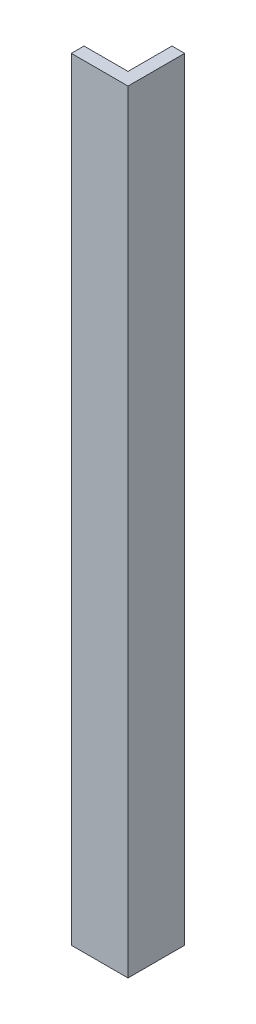
ISO-10303-21;
HEADER;
FILE_DESCRIPTION(('STEP AP214'),'2;1');
FILE_NAME('part.step','',(''),(''),'','','');
FILE_SCHEMA(('AUTOMOTIVE_DESIGN { 1 0 10303 214 1 1 1 1 }'));
ENDSEC;
DATA;
#1=APPLICATION_CONTEXT('core data for automotive mechanical design processes');
#2=APPLICATION_PROTOCOL_DEFINITION('international standard','automotive_design',2000,#1);
#3=PRODUCT_CONTEXT('',#1,'mechanical');
#4=PRODUCT('Part','Part','',(#3));
#5=PRODUCT_RELATED_PRODUCT_CATEGORY('part','',(#4));
#6=PRODUCT_DEFINITION_FORMATION('','',#4);
#7=PRODUCT_DEFINITION_CONTEXT('part definition',#1,'design');
#8=PRODUCT_DEFINITION('design','',#6,#7);
#9=PRODUCT_DEFINITION_SHAPE('','',#8);
#10=(LENGTH_UNIT() NAMED_UNIT(*) SI_UNIT(.MILLI.,.METRE.));
#11=(NAMED_UNIT(*) PLANE_ANGLE_UNIT() SI_UNIT($,.RADIAN.));
#12=(NAMED_UNIT(*) SI_UNIT($,.STERADIAN.) SOLID_ANGLE_UNIT());
#13=UNCERTAINTY_MEASURE_WITH_UNIT(LENGTH_MEASURE(1.E-05),#10,'distance_accuracy_value','');
#14=(GEOMETRIC_REPRESENTATION_CONTEXT(3) GLOBAL_UNCERTAINTY_ASSIGNED_CONTEXT((#13)) GLOBAL_UNIT_ASSIGNED_CONTEXT((#10,
#11,#12)) REPRESENTATION_CONTEXT('',''));
#15=CARTESIAN_POINT('',(0.,0.,0.));
#16=DIRECTION('',(0.,0.,1.));
#17=DIRECTION('',(1.,0.,0.));
#18=AXIS2_PLACEMENT_3D('',#15,#16,#17);
#19=CARTESIAN_POINT('',(-3.17500000000001,213.221477246639,-3.17500000000001));
#20=DIRECTION('',(-1.,0.,0.));
#21=DIRECTION('',(0.,0.,1.));
#22=AXIS2_PLACEMENT_3D('',#19,#20,#21);
#23=PLANE('',#22);
#24=DIRECTION('',(0.,-1.,0.));
#25=VECTOR('',#24,1.);
#26=CARTESIAN_POINT('',(-3.17500000000001,213.221477246639,-3.17500000000001));
#27=LINE('',#26,#25);
#28=CARTESIAN_POINT('',(-3.17500000000001,193.175,-3.17500000000001));
#29=VERTEX_POINT('',#28);
#30=CARTESIAN_POINT('',(-3.17500000000001,0.,-3.17500000000001));
#31=VERTEX_POINT('',#30);
#32=EDGE_CURVE('E125',#29,#31,#27,.T.);
#33=ORIENTED_EDGE('',*,*,#32,.F.);
#34=DIRECTION('',(0.,0.,-1.));
#35=VECTOR('',#34,1.);
#36=CARTESIAN_POINT('',(-3.17500000000001,193.175,-3.175));
#37=LINE('',#36,#35);
#38=CARTESIAN_POINT('',(-3.175,193.175,-14.175));
#39=VERTEX_POINT('',#38);
#40=EDGE_CURVE('E123',#29,#39,#37,.T.);
#41=ORIENTED_EDGE('',*,*,#40,.T.);
#42=DIRECTION('',(0.,-1.,0.));
#43=VECTOR('',#42,1.);
#44=CARTESIAN_POINT('',(-3.175,213.221477246639,-14.175));
#45=LINE('',#44,#43);
#46=CARTESIAN_POINT('',(-3.175,0.,-14.175));
#47=VERTEX_POINT('',#46);
#48=EDGE_CURVE('E37',#39,#47,#45,.T.);
#49=ORIENTED_EDGE('',*,*,#48,.T.);
#50=DIRECTION('',(0.,0.,-1.));
#51=VECTOR('',#50,1.);
#52=CARTESIAN_POINT('',(-3.17500000000001,0.,-3.17500000000001));
#53=LINE('',#52,#51);
#54=EDGE_CURVE('E116',#31,#47,#53,.T.);
#55=ORIENTED_EDGE('',*,*,#54,.F.);
#56=EDGE_LOOP('',(#33,#41,#49,#55));
#57=FACE_BOUND('',#56,.T.);
#58=ADVANCED_FACE('F33',(#57),#23,.T.);
#59=CARTESIAN_POINT('',(-3.17500000000001,213.221477246639,-3.17500000000001));
#60=DIRECTION('',(0.,0.,1.));
#61=DIRECTION('',(1.,0.,0.));
#62=AXIS2_PLACEMENT_3D('',#59,#60,#61);
#63=PLANE('',#62);
#64=DIRECTION('',(-1.,0.,0.));
#65=VECTOR('',#64,1.);
#66=CARTESIAN_POINT('',(-3.17500000000002,193.175,-3.17500000000001));
#67=LINE('',#66,#65);
#68=CARTESIAN_POINT('',(-14.175,193.175,-3.175));
#69=VERTEX_POINT('',#68);
#70=EDGE_CURVE('E72',#29,#69,#67,.T.);
#71=ORIENTED_EDGE('',*,*,#70,.F.);
#72=ORIENTED_EDGE('',*,*,#32,.T.);
#73=DIRECTION('',(-1.,0.,0.));
#74=VECTOR('',#73,1.);
#75=CARTESIAN_POINT('',(-3.17500000000001,0.,-3.17500000000001));
#76=LINE('',#75,#74);
#77=CARTESIAN_POINT('',(-14.175,0.,-3.175));
#78=VERTEX_POINT('',#77);
#79=EDGE_CURVE('E127',#31,#78,#76,.T.);
#80=ORIENTED_EDGE('',*,*,#79,.T.);
#81=DIRECTION('',(0.,-1.,0.));
#82=VECTOR('',#81,1.);
#83=CARTESIAN_POINT('',(-14.175,213.221477246639,-3.175));
#84=LINE('',#83,#82);
#85=EDGE_CURVE('E128',#69,#78,#84,.T.);
#86=ORIENTED_EDGE('',*,*,#85,.F.);
#87=EDGE_LOOP('',(#71,#72,#80,#86));
#88=FACE_BOUND('',#87,.T.);
#89=ADVANCED_FACE('F142',(#88),#63,.F.);
#90=CARTESIAN_POINT('',(-14.175,213.221477246639,-3.175));
#91=DIRECTION('',(1.,0.,0.));
#92=DIRECTION('',(0.,0.,-1.));
#93=AXIS2_PLACEMENT_3D('',#90,#91,#92);
#94=PLANE('',#93);
#95=DIRECTION('',(0.,0.,1.));
#96=VECTOR('',#95,1.);
#97=CARTESIAN_POINT('',(-14.175,193.175,-3.175));
#98=LINE('',#97,#96);
#99=CARTESIAN_POINT('',(-14.175,193.175,0.));
#100=VERTEX_POINT('',#99);
#101=EDGE_CURVE('E42',#69,#100,#98,.T.);
#102=ORIENTED_EDGE('',*,*,#101,.F.);
#103=ORIENTED_EDGE('',*,*,#85,.T.);
#104=DIRECTION('',(0.,0.,1.));
#105=VECTOR('',#104,1.);
#106=CARTESIAN_POINT('',(-14.175,0.,-3.175));
#107=LINE('',#106,#105);
#108=CARTESIAN_POINT('',(-14.175,0.,0.));
#109=VERTEX_POINT('',#108);
#110=EDGE_CURVE('E119',#78,#109,#107,.T.);
#111=ORIENTED_EDGE('',*,*,#110,.T.);
#112=DIRECTION('',(0.,-1.,0.));
#113=VECTOR('',#112,1.);
#114=CARTESIAN_POINT('',(-14.175,213.221477246639,0.));
#115=LINE('',#114,#113);
#116=EDGE_CURVE('E93',#100,#109,#115,.T.);
#117=ORIENTED_EDGE('',*,*,#116,.F.);
#118=EDGE_LOOP('',(#102,#103,#111,#117));
#119=FACE_BOUND('',#118,.T.);
#120=ADVANCED_FACE('F141',(#119),#94,.F.);
#121=CARTESIAN_POINT('',(0.,213.221477246639,0.));
#122=DIRECTION('',(0.,0.,1.));
#123=DIRECTION('',(1.,0.,0.));
#124=AXIS2_PLACEMENT_3D('',#121,#122,#123);
#125=PLANE('',#124);
#126=DIRECTION('',(0.,-1.,0.));
#127=VECTOR('',#126,1.);
#128=CARTESIAN_POINT('',(0.,213.221477246639,0.));
#129=LINE('',#128,#127);
#130=CARTESIAN_POINT('',(0.,193.175,0.));
#131=VERTEX_POINT('',#130);
#132=CARTESIAN_POINT('',(0.,0.,0.));
#133=VERTEX_POINT('',#132);
#134=EDGE_CURVE('E104',#131,#133,#129,.T.);
#135=ORIENTED_EDGE('',*,*,#134,.F.);
#136=DIRECTION('',(-1.,0.,0.));
#137=VECTOR('',#136,1.);
#138=CARTESIAN_POINT('',(0.,193.175,0.));
#139=LINE('',#138,#137);
#140=EDGE_CURVE('E110',#131,#100,#139,.T.);
#141=ORIENTED_EDGE('',*,*,#140,.T.);
#142=ORIENTED_EDGE('',*,*,#116,.T.);
#143=DIRECTION('',(-1.,0.,0.));
#144=VECTOR('',#143,1.);
#145=CARTESIAN_POINT('',(0.,0.,0.));
#146=LINE('',#145,#144);
#147=EDGE_CURVE('E122',#133,#109,#146,.T.);
#148=ORIENTED_EDGE('',*,*,#147,.F.);
#149=EDGE_LOOP('',(#135,#141,#142,#148));
#150=FACE_BOUND('',#149,.T.);
#151=ADVANCED_FACE('F149',(#150),#125,.T.);
#152=CARTESIAN_POINT('',(0.,213.221477246639,-14.175));
#153=DIRECTION('',(1.,0.,0.));
#154=DIRECTION('',(0.,0.,-1.));
#155=AXIS2_PLACEMENT_3D('',#152,#153,#154);
#156=PLANE('',#155);
#157=DIRECTION('',(0.,-1.,0.));
#158=VECTOR('',#157,1.);
#159=CARTESIAN_POINT('',(0.,213.221477246639,-14.175));
#160=LINE('',#159,#158);
#161=CARTESIAN_POINT('',(0.,193.175,-14.175));
#162=VERTEX_POINT('',#161);
#163=CARTESIAN_POINT('',(0.,0.,-14.175));
#164=VERTEX_POINT('',#163);
#165=EDGE_CURVE('E55',#162,#164,#160,.T.);
#166=ORIENTED_EDGE('',*,*,#165,.F.);
#167=DIRECTION('',(0.,0.,1.));
#168=VECTOR('',#167,1.);
#169=CARTESIAN_POINT('',(0.,193.175,-14.175));
#170=LINE('',#169,#168);
#171=EDGE_CURVE('E99',#162,#131,#170,.T.);
#172=ORIENTED_EDGE('',*,*,#171,.T.);
#173=ORIENTED_EDGE('',*,*,#134,.T.);
#174=DIRECTION('',(0.,0.,1.));
#175=VECTOR('',#174,1.);
#176=CARTESIAN_POINT('',(0.,0.,-14.175));
#177=LINE('',#176,#175);
#178=EDGE_CURVE('E102',#164,#133,#177,.T.);
#179=ORIENTED_EDGE('',*,*,#178,.F.);
#180=EDGE_LOOP('',(#166,#172,#173,#179));
#181=FACE_BOUND('',#180,.T.);
#182=ADVANCED_FACE('F97',(#181),#156,.T.);
#183=CARTESIAN_POINT('',(0.,213.221477246639,-14.175));
#184=DIRECTION('',(0.,0.,1.));
#185=DIRECTION('',(1.,0.,0.));
#186=AXIS2_PLACEMENT_3D('',#183,#184,#185);
#187=PLANE('',#186);
#188=DIRECTION('',(-1.,0.,0.));
#189=VECTOR('',#188,1.);
#190=CARTESIAN_POINT('',(0.,193.175,-14.175));
#191=LINE('',#190,#189);
#192=EDGE_CURVE('E11',#162,#39,#191,.T.);
#193=ORIENTED_EDGE('',*,*,#192,.F.);
#194=ORIENTED_EDGE('',*,*,#165,.T.);
#195=DIRECTION('',(-1.,0.,0.));
#196=VECTOR('',#195,1.);
#197=CARTESIAN_POINT('',(0.,0.,-14.175));
#198=LINE('',#197,#196);
#199=EDGE_CURVE('E103',#164,#47,#198,.T.);
#200=ORIENTED_EDGE('',*,*,#199,.T.);
#201=ORIENTED_EDGE('',*,*,#48,.F.);
#202=EDGE_LOOP('',(#193,#194,#200,#201));
#203=FACE_BOUND('',#202,.T.);
#204=ADVANCED_FACE('F105',(#203),#187,.F.);
#205=CARTESIAN_POINT('',(0.,0.,0.));
#206=DIRECTION('',(0.,1.,0.));
#207=DIRECTION('',(0.,0.,1.));
#208=AXIS2_PLACEMENT_3D('',#205,#206,#207);
#209=PLANE('',#208);
#210=ORIENTED_EDGE('',*,*,#54,.T.);
#211=ORIENTED_EDGE('',*,*,#199,.F.);
#212=ORIENTED_EDGE('',*,*,#178,.T.);
#213=ORIENTED_EDGE('',*,*,#147,.T.);
#214=ORIENTED_EDGE('',*,*,#110,.F.);
#215=ORIENTED_EDGE('',*,*,#79,.F.);
#216=EDGE_LOOP('',(#210,#211,#212,#213,#214,#215));
#217=FACE_BOUND('',#216,.T.);
#218=ADVANCED_FACE('F140',(#217),#209,.F.);
#219=CARTESIAN_POINT('',(-0.175000000000005,193.175,4.87147724663878));
#220=DIRECTION('',(0.,1.,0.));
#221=DIRECTION('',(-1.,0.,0.));
#222=AXIS2_PLACEMENT_3D('',#219,#220,#221);
#223=PLANE('',#222);
#224=ORIENTED_EDGE('',*,*,#40,.F.);
#225=ORIENTED_EDGE('',*,*,#70,.T.);
#226=ORIENTED_EDGE('',*,*,#101,.T.);
#227=ORIENTED_EDGE('',*,*,#140,.F.);
#228=ORIENTED_EDGE('',*,*,#171,.F.);
#229=ORIENTED_EDGE('',*,*,#192,.T.);
#230=EDGE_LOOP('',(#224,#225,#226,#227,#228,#229));
#231=FACE_BOUND('',#230,.T.);
#232=ADVANCED_FACE('F35',(#231),#223,.T.);
#233=CLOSED_SHELL('',(#58,#89,#120,#151,#182,#204,#218,#232));
#234=MANIFOLD_SOLID_BREP('B2',#233);
#235=ADVANCED_BREP_SHAPE_REPRESENTATION('',(#18,#234),#14);
#236=SHAPE_DEFINITION_REPRESENTATION(#9,#235);
ENDSEC;
END-ISO-10303-21;
